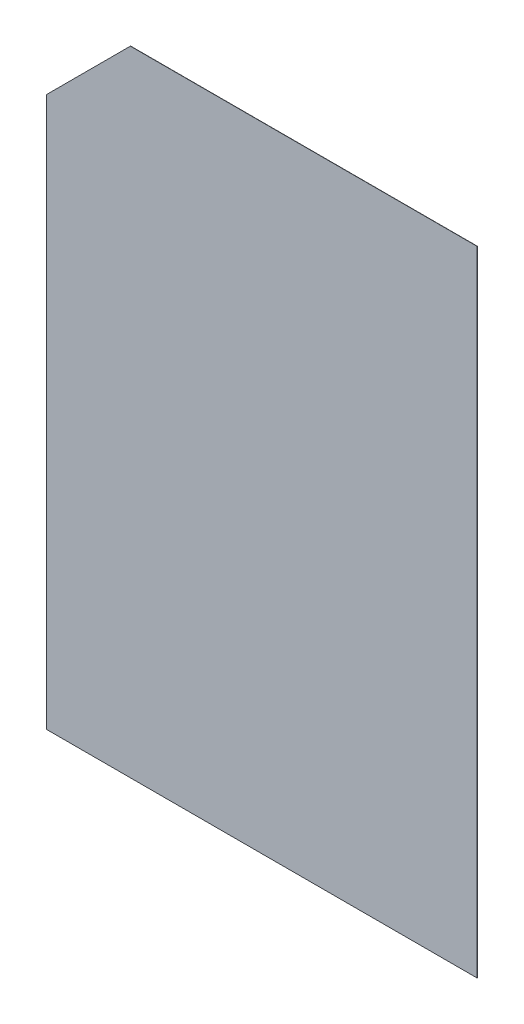
ISO-10303-21;
HEADER;
FILE_DESCRIPTION(('STEP AP214'),'2;1');
FILE_NAME('part.step','',(''),(''),'','','');
FILE_SCHEMA(('AUTOMOTIVE_DESIGN { 1 0 10303 214 1 1 1 1 }'));
ENDSEC;
DATA;
#1=APPLICATION_CONTEXT('core data for automotive mechanical design processes');
#2=APPLICATION_PROTOCOL_DEFINITION('international standard','automotive_design',2000,#1);
#3=PRODUCT_CONTEXT('',#1,'mechanical');
#4=PRODUCT('Part','Part','',(#3));
#5=PRODUCT_RELATED_PRODUCT_CATEGORY('part','',(#4));
#6=PRODUCT_DEFINITION_FORMATION('','',#4);
#7=PRODUCT_DEFINITION_CONTEXT('part definition',#1,'design');
#8=PRODUCT_DEFINITION('design','',#6,#7);
#9=PRODUCT_DEFINITION_SHAPE('','',#8);
#10=(LENGTH_UNIT() NAMED_UNIT(*) SI_UNIT(.MILLI.,.METRE.));
#11=(NAMED_UNIT(*) PLANE_ANGLE_UNIT() SI_UNIT($,.RADIAN.));
#12=(NAMED_UNIT(*) SI_UNIT($,.STERADIAN.) SOLID_ANGLE_UNIT());
#13=UNCERTAINTY_MEASURE_WITH_UNIT(LENGTH_MEASURE(1.E-05),#10,'distance_accuracy_value','');
#14=(GEOMETRIC_REPRESENTATION_CONTEXT(3) GLOBAL_UNCERTAINTY_ASSIGNED_CONTEXT((#13)) GLOBAL_UNIT_ASSIGNED_CONTEXT((#10,
#11,#12)) REPRESENTATION_CONTEXT('',''));
#15=CARTESIAN_POINT('',(0.,0.,0.));
#16=DIRECTION('',(0.,0.,1.));
#17=DIRECTION('',(1.,0.,0.));
#18=AXIS2_PLACEMENT_3D('',#15,#16,#17);
#19=CARTESIAN_POINT('',(0.,0.,0.001));
#20=DIRECTION('',(0.,0.,-1.));
#21=DIRECTION('',(-1.,0.,0.));
#22=AXIS2_PLACEMENT_3D('',#19,#20,#21);
#23=PLANE('',#22);
#24=DIRECTION('',(0.,1.,0.));
#25=VECTOR('',#24,1.);
#26=CARTESIAN_POINT('',(1.8,0.,0.001));
#27=LINE('',#26,#25);
#28=CARTESIAN_POINT('',(1.8,0.,0.001));
#29=VERTEX_POINT('',#28);
#30=CARTESIAN_POINT('',(1.8,2.65,0.001));
#31=VERTEX_POINT('',#30);
#32=EDGE_CURVE('E84',#29,#31,#27,.T.);
#33=ORIENTED_EDGE('',*,*,#32,.T.);
#34=DIRECTION('',(1.,0.,0.));
#35=VECTOR('',#34,1.);
#36=CARTESIAN_POINT('',(1.8,2.65,0.001));
#37=LINE('',#36,#35);
#38=CARTESIAN_POINT('',(0.35,2.65,0.001));
#39=VERTEX_POINT('',#38);
#40=EDGE_CURVE('E65',#31,#39,#37,.F.);
#41=ORIENTED_EDGE('',*,*,#40,.T.);
#42=DIRECTION('',(0.707106781186548,0.707106781186548,0.));
#43=VECTOR('',#42,1.);
#44=CARTESIAN_POINT('',(0.35,2.65,0.001));
#45=LINE('',#44,#43);
#46=CARTESIAN_POINT('',(0.,2.3,0.001));
#47=VERTEX_POINT('',#46);
#48=EDGE_CURVE('E59',#39,#47,#45,.F.);
#49=ORIENTED_EDGE('',*,*,#48,.T.);
#50=DIRECTION('',(0.,1.,0.));
#51=VECTOR('',#50,1.);
#52=CARTESIAN_POINT('',(0.,2.3,0.001));
#53=LINE('',#52,#51);
#54=CARTESIAN_POINT('',(0.,0.,0.001));
#55=VERTEX_POINT('',#54);
#56=EDGE_CURVE('E62',#47,#55,#53,.F.);
#57=ORIENTED_EDGE('',*,*,#56,.T.);
#58=DIRECTION('',(1.,0.,0.));
#59=VECTOR('',#58,1.);
#60=CARTESIAN_POINT('',(0.,0.,0.001));
#61=LINE('',#60,#59);
#62=EDGE_CURVE('E92',#55,#29,#61,.T.);
#63=ORIENTED_EDGE('',*,*,#62,.T.);
#64=EDGE_LOOP('',(#33,#41,#49,#57,#63));
#65=FACE_BOUND('',#64,.T.);
#66=ADVANCED_FACE('F16',(#65),#23,.F.);
#67=CARTESIAN_POINT('',(0.,2.3,0.));
#68=DIRECTION('',(1.,0.,0.));
#69=DIRECTION('',(0.,0.,-1.));
#70=AXIS2_PLACEMENT_3D('',#67,#68,#69);
#71=PLANE('',#70);
#72=DIRECTION('',(0.,0.,-1.));
#73=VECTOR('',#72,1.);
#74=CARTESIAN_POINT('',(0.,0.,0.));
#75=LINE('',#74,#73);
#76=CARTESIAN_POINT('',(0.,0.,0.));
#77=VERTEX_POINT('',#76);
#78=EDGE_CURVE('E75',#77,#55,#75,.F.);
#79=ORIENTED_EDGE('',*,*,#78,.T.);
#80=ORIENTED_EDGE('',*,*,#56,.F.);
#81=DIRECTION('',(0.,0.,-1.));
#82=VECTOR('',#81,1.);
#83=CARTESIAN_POINT('',(0.,2.3,0.));
#84=LINE('',#83,#82);
#85=CARTESIAN_POINT('',(0.,2.3,0.));
#86=VERTEX_POINT('',#85);
#87=EDGE_CURVE('E19',#47,#86,#84,.T.);
#88=ORIENTED_EDGE('',*,*,#87,.T.);
#89=DIRECTION('',(0.,1.,0.));
#90=VECTOR('',#89,1.);
#91=CARTESIAN_POINT('',(0.,0.,0.));
#92=LINE('',#91,#90);
#93=EDGE_CURVE('E89',#77,#86,#92,.T.);
#94=ORIENTED_EDGE('',*,*,#93,.F.);
#95=EDGE_LOOP('',(#79,#80,#88,#94));
#96=FACE_BOUND('',#95,.T.);
#97=ADVANCED_FACE('F72',(#96),#71,.F.);
#98=CARTESIAN_POINT('',(0.35,2.65,0.));
#99=DIRECTION('',(0.707106781186548,-0.707106781186548,0.));
#100=DIRECTION('',(0.707106781186548,0.707106781186548,0.));
#101=AXIS2_PLACEMENT_3D('',#98,#99,#100);
#102=PLANE('',#101);
#103=ORIENTED_EDGE('',*,*,#87,.F.);
#104=ORIENTED_EDGE('',*,*,#48,.F.);
#105=DIRECTION('',(0.,0.,1.));
#106=VECTOR('',#105,1.);
#107=CARTESIAN_POINT('',(0.35,2.65,0.));
#108=LINE('',#107,#106);
#109=CARTESIAN_POINT('',(0.35,2.65,0.));
#110=VERTEX_POINT('',#109);
#111=EDGE_CURVE('E82',#39,#110,#108,.F.);
#112=ORIENTED_EDGE('',*,*,#111,.T.);
#113=DIRECTION('',(0.707106781186547,0.707106781186548,0.));
#114=VECTOR('',#113,1.);
#115=CARTESIAN_POINT('',(0.,2.3,0.));
#116=LINE('',#115,#114);
#117=EDGE_CURVE('E80',#86,#110,#116,.T.);
#118=ORIENTED_EDGE('',*,*,#117,.F.);
#119=EDGE_LOOP('',(#103,#104,#112,#118));
#120=FACE_BOUND('',#119,.T.);
#121=ADVANCED_FACE('F78',(#120),#102,.F.);
#122=CARTESIAN_POINT('',(1.8,2.65,0.));
#123=DIRECTION('',(0.,-1.,0.));
#124=DIRECTION('',(0.,0.,-1.));
#125=AXIS2_PLACEMENT_3D('',#122,#123,#124);
#126=PLANE('',#125);
#127=ORIENTED_EDGE('',*,*,#111,.F.);
#128=ORIENTED_EDGE('',*,*,#40,.F.);
#129=DIRECTION('',(0.,0.,-1.));
#130=VECTOR('',#129,1.);
#131=CARTESIAN_POINT('',(1.8,2.65,0.));
#132=LINE('',#131,#130);
#133=CARTESIAN_POINT('',(1.8,2.65,0.));
#134=VERTEX_POINT('',#133);
#135=EDGE_CURVE('E94',#31,#134,#132,.T.);
#136=ORIENTED_EDGE('',*,*,#135,.T.);
#137=DIRECTION('',(-1.,0.,0.));
#138=VECTOR('',#137,1.);
#139=CARTESIAN_POINT('',(0.,2.65,0.));
#140=LINE('',#139,#138);
#141=EDGE_CURVE('E87',#110,#134,#140,.F.);
#142=ORIENTED_EDGE('',*,*,#141,.F.);
#143=EDGE_LOOP('',(#127,#128,#136,#142));
#144=FACE_BOUND('',#143,.T.);
#145=ADVANCED_FACE('F108',(#144),#126,.F.);
#146=CARTESIAN_POINT('',(1.8,0.,0.));
#147=DIRECTION('',(-1.,0.,0.));
#148=DIRECTION('',(0.,0.,1.));
#149=AXIS2_PLACEMENT_3D('',#146,#147,#148);
#150=PLANE('',#149);
#151=ORIENTED_EDGE('',*,*,#135,.F.);
#152=ORIENTED_EDGE('',*,*,#32,.F.);
#153=DIRECTION('',(0.,0.,1.));
#154=VECTOR('',#153,1.);
#155=CARTESIAN_POINT('',(1.8,0.,0.));
#156=LINE('',#155,#154);
#157=CARTESIAN_POINT('',(1.8,0.,0.));
#158=VERTEX_POINT('',#157);
#159=EDGE_CURVE('E34',#29,#158,#156,.F.);
#160=ORIENTED_EDGE('',*,*,#159,.T.);
#161=DIRECTION('',(0.,1.,0.));
#162=VECTOR('',#161,1.);
#163=CARTESIAN_POINT('',(1.8,0.,0.));
#164=LINE('',#163,#162);
#165=EDGE_CURVE('E25',#134,#158,#164,.F.);
#166=ORIENTED_EDGE('',*,*,#165,.F.);
#167=EDGE_LOOP('',(#151,#152,#160,#166));
#168=FACE_BOUND('',#167,.T.);
#169=ADVANCED_FACE('F103',(#168),#150,.F.);
#170=CARTESIAN_POINT('',(0.,0.,0.));
#171=DIRECTION('',(0.,1.,0.));
#172=DIRECTION('',(0.,0.,1.));
#173=AXIS2_PLACEMENT_3D('',#170,#171,#172);
#174=PLANE('',#173);
#175=ORIENTED_EDGE('',*,*,#159,.F.);
#176=ORIENTED_EDGE('',*,*,#62,.F.);
#177=ORIENTED_EDGE('',*,*,#78,.F.);
#178=DIRECTION('',(-1.,0.,0.));
#179=VECTOR('',#178,1.);
#180=CARTESIAN_POINT('',(0.,0.,0.));
#181=LINE('',#180,#179);
#182=EDGE_CURVE('E11',#158,#77,#181,.T.);
#183=ORIENTED_EDGE('',*,*,#182,.F.);
#184=EDGE_LOOP('',(#175,#176,#177,#183));
#185=FACE_BOUND('',#184,.T.);
#186=ADVANCED_FACE('F104',(#185),#174,.F.);
#187=CARTESIAN_POINT('',(0.,0.,0.));
#188=DIRECTION('',(0.,0.,-1.));
#189=DIRECTION('',(-1.,0.,0.));
#190=AXIS2_PLACEMENT_3D('',#187,#188,#189);
#191=PLANE('',#190);
#192=ORIENTED_EDGE('',*,*,#165,.T.);
#193=ORIENTED_EDGE('',*,*,#182,.T.);
#194=ORIENTED_EDGE('',*,*,#93,.T.);
#195=ORIENTED_EDGE('',*,*,#117,.T.);
#196=ORIENTED_EDGE('',*,*,#141,.T.);
#197=EDGE_LOOP('',(#192,#193,#194,#195,#196));
#198=FACE_BOUND('',#197,.T.);
#199=ADVANCED_FACE('F107',(#198),#191,.T.);
#200=CLOSED_SHELL('',(#66,#97,#121,#145,#169,#186,#199));
#201=MANIFOLD_SOLID_BREP('B1',#200);
#202=ADVANCED_BREP_SHAPE_REPRESENTATION('',(#18,#201),#14);
#203=SHAPE_DEFINITION_REPRESENTATION(#9,#202);
ENDSEC;
END-ISO-10303-21;
